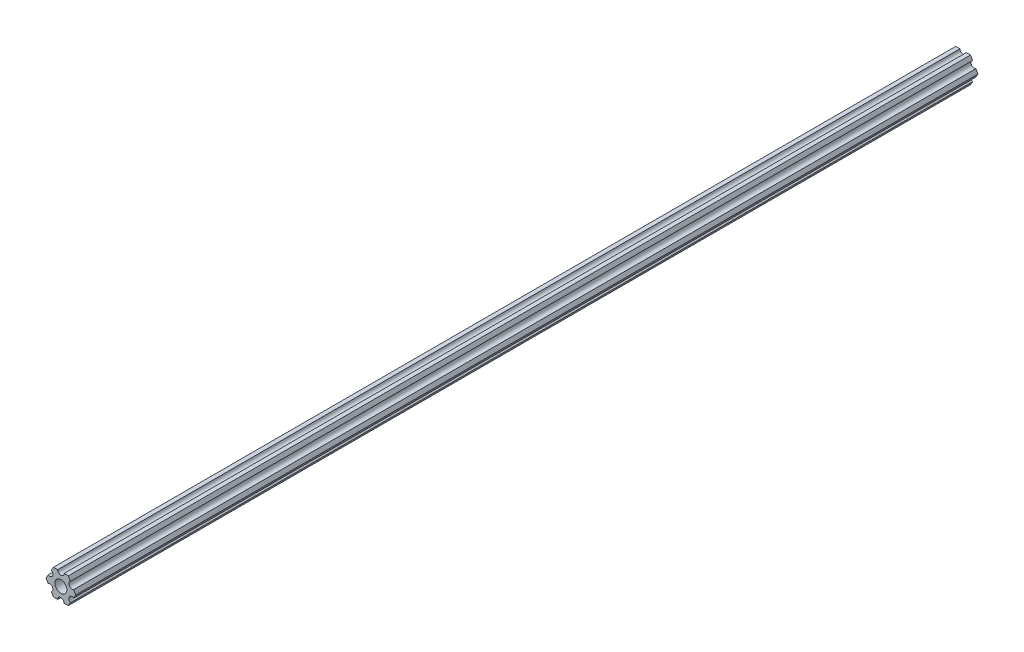
ISO-10303-21;
HEADER;
FILE_DESCRIPTION(('STEP AP214'),'2;1');
FILE_NAME('part.step','',(''),(''),'','','');
FILE_SCHEMA(('AUTOMOTIVE_DESIGN { 1 0 10303 214 1 1 1 1 }'));
ENDSEC;
DATA;
#1=APPLICATION_CONTEXT('core data for automotive mechanical design processes');
#2=APPLICATION_PROTOCOL_DEFINITION('international standard','automotive_design',2000,#1);
#3=PRODUCT_CONTEXT('',#1,'mechanical');
#4=PRODUCT('Part','Part','',(#3));
#5=PRODUCT_RELATED_PRODUCT_CATEGORY('part','',(#4));
#6=PRODUCT_DEFINITION_FORMATION('','',#4);
#7=PRODUCT_DEFINITION_CONTEXT('part definition',#1,'design');
#8=PRODUCT_DEFINITION('design','',#6,#7);
#9=PRODUCT_DEFINITION_SHAPE('','',#8);
#10=(LENGTH_UNIT() NAMED_UNIT(*) SI_UNIT(.MILLI.,.METRE.));
#11=(NAMED_UNIT(*) PLANE_ANGLE_UNIT() SI_UNIT($,.RADIAN.));
#12=(NAMED_UNIT(*) SI_UNIT($,.STERADIAN.) SOLID_ANGLE_UNIT());
#13=UNCERTAINTY_MEASURE_WITH_UNIT(LENGTH_MEASURE(1.E-05),#10,'distance_accuracy_value','');
#14=(GEOMETRIC_REPRESENTATION_CONTEXT(3) GLOBAL_UNCERTAINTY_ASSIGNED_CONTEXT((#13)) GLOBAL_UNIT_ASSIGNED_CONTEXT((#10,
#11,#12)) REPRESENTATION_CONTEXT('',''));
#15=CARTESIAN_POINT('',(0.,0.,0.));
#16=DIRECTION('',(0.,0.,1.));
#17=DIRECTION('',(1.,0.,0.));
#18=AXIS2_PLACEMENT_3D('',#15,#16,#17);
#19=CARTESIAN_POINT('',(6.29301142309098,-1.80018429024546,85.725));
#20=DIRECTION('',(-0.866025434075723,0.499999947533953,0.));
#21=DIRECTION('',(0.,0.,1.));
#22=AXIS2_PLACEMENT_3D('',#19,#20,#21);
#23=PLANE('',#22);
#24=DIRECTION('',(0.,0.,1.));
#25=VECTOR('',#24,1.);
#26=CARTESIAN_POINT('',(7.33234841870827,4.44212519169686E-07,85.725));
#27=LINE('',#26,#25);
#28=CARTESIAN_POINT('',(7.33234841870826,4.44212518961143E-07,-358.775));
#29=VERTEX_POINT('',#28);
#30=CARTESIAN_POINT('',(7.33234841870826,4.44212519315656E-07,85.725));
#31=VERTEX_POINT('',#30);
#32=EDGE_CURVE('E11',#29,#31,#27,.T.);
#33=ORIENTED_EDGE('',*,*,#32,.T.);
#34=DIRECTION('',(0.499999947533953,0.866025434075723,0.));
#35=VECTOR('',#34,1.);
#36=CARTESIAN_POINT('',(6.29301142309098,-1.80018429024546,85.725));
#37=LINE('',#36,#35);
#38=CARTESIAN_POINT('',(6.29301142309098,-1.80018429024546,85.725));
#39=VERTEX_POINT('',#38);
#40=EDGE_CURVE('E301',#39,#31,#37,.T.);
#41=ORIENTED_EDGE('',*,*,#40,.F.);
#42=DIRECTION('',(0.,0.,-1.));
#43=VECTOR('',#42,1.);
#44=CARTESIAN_POINT('',(6.29301142309098,-1.80018429024546,85.725));
#45=LINE('',#44,#43);
#46=CARTESIAN_POINT('',(6.29301142309098,-1.80018429024546,-358.775));
#47=VERTEX_POINT('',#46);
#48=EDGE_CURVE('E300',#39,#47,#45,.T.);
#49=ORIENTED_EDGE('',*,*,#48,.T.);
#50=DIRECTION('',(-0.499999947533953,-0.866025434075723,0.));
#51=VECTOR('',#50,1.);
#52=CARTESIAN_POINT('',(6.29301142309098,-1.80018429024546,-358.775));
#53=LINE('',#52,#51);
#54=EDGE_CURVE('E219',#29,#47,#53,.T.);
#55=ORIENTED_EDGE('',*,*,#54,.F.);
#56=EDGE_LOOP('',(#33,#41,#49,#55));
#57=FACE_BOUND('',#56,.T.);
#58=ADVANCED_FACE('F51',(#57),#23,.F.);
#59=CARTESIAN_POINT('',(7.33234841870827,4.44212519169686E-07,85.725));
#60=DIRECTION('',(-0.866025373493145,-0.500000052466057,0.));
#61=DIRECTION('',(-0.500000052466057,0.866025373493145,0.));
#62=AXIS2_PLACEMENT_3D('',#59,#60,#61);
#63=PLANE('',#62);
#64=DIRECTION('',(0.,0.,1.));
#65=VECTOR('',#64,1.);
#66=CARTESIAN_POINT('',(6.29301120497139,1.80018505273894,85.725));
#67=LINE('',#66,#65);
#68=CARTESIAN_POINT('',(6.29301120497139,1.80018505273894,-358.775));
#69=VERTEX_POINT('',#68);
#70=CARTESIAN_POINT('',(6.29301120497139,1.80018505273894,85.725));
#71=VERTEX_POINT('',#70);
#72=EDGE_CURVE('E59',#69,#71,#67,.T.);
#73=ORIENTED_EDGE('',*,*,#72,.T.);
#74=DIRECTION('',(-0.500000052466057,0.866025373493145,0.));
#75=VECTOR('',#74,1.);
#76=CARTESIAN_POINT('',(7.33234841870827,4.44212519198906E-07,85.725));
#77=LINE('',#76,#75);
#78=EDGE_CURVE('E305',#31,#71,#77,.T.);
#79=ORIENTED_EDGE('',*,*,#78,.F.);
#80=ORIENTED_EDGE('',*,*,#32,.F.);
#81=DIRECTION('',(0.500000052466055,-0.866025373493145,0.));
#82=VECTOR('',#81,1.);
#83=CARTESIAN_POINT('',(7.33234841870826,4.44212518961143E-07,-358.775));
#84=LINE('',#83,#82);
#85=EDGE_CURVE('E213',#69,#29,#84,.T.);
#86=ORIENTED_EDGE('',*,*,#85,.F.);
#87=EDGE_LOOP('',(#73,#79,#80,#86));
#88=FACE_BOUND('',#87,.T.);
#89=ADVANCED_FACE('F214',(#88),#63,.F.);
#90=CARTESIAN_POINT('',(4.70551103839172,4.54981561357972,85.725));
#91=DIRECTION('',(-0.866025373493151,-0.500000052466046,0.));
#92=DIRECTION('',(-0.500000052466046,0.866025373493151,0.));
#93=AXIS2_PLACEMENT_3D('',#90,#91,#92);
#94=PLANE('',#93);
#95=DIRECTION('',(0.,0.,1.));
#96=VECTOR('',#95,1.);
#97=CARTESIAN_POINT('',(3.66617382465481,6.35000022210627,85.725));
#98=LINE('',#97,#96);
#99=CARTESIAN_POINT('',(3.66617382465481,6.35000022210627,-358.775));
#100=VERTEX_POINT('',#99);
#101=CARTESIAN_POINT('',(3.66617382465481,6.35000022210627,85.725));
#102=VERTEX_POINT('',#101);
#103=EDGE_CURVE('E211',#100,#102,#98,.T.);
#104=ORIENTED_EDGE('',*,*,#103,.T.);
#105=DIRECTION('',(-0.500000052466046,0.866025373493151,0.));
#106=VECTOR('',#105,1.);
#107=CARTESIAN_POINT('',(4.70551103839172,4.54981561357972,85.725));
#108=LINE('',#107,#106);
#109=CARTESIAN_POINT('',(4.70551103839172,4.54981561357972,85.725));
#110=VERTEX_POINT('',#109);
#111=EDGE_CURVE('E336',#110,#102,#108,.T.);
#112=ORIENTED_EDGE('',*,*,#111,.F.);
#113=DIRECTION('',(0.,0.,1.));
#114=VECTOR('',#113,1.);
#115=CARTESIAN_POINT('',(4.70551103839172,4.54981561357972,85.725));
#116=LINE('',#115,#114);
#117=CARTESIAN_POINT('',(4.70551103839172,4.54981561357972,-358.775));
#118=VERTEX_POINT('',#117);
#119=EDGE_CURVE('E299',#118,#110,#116,.T.);
#120=ORIENTED_EDGE('',*,*,#119,.F.);
#121=DIRECTION('',(0.500000052466045,-0.866025373493151,0.));
#122=VECTOR('',#121,1.);
#123=CARTESIAN_POINT('',(4.70551103839172,4.54981561357972,-358.775));
#124=LINE('',#123,#122);
#125=EDGE_CURVE('E225',#100,#118,#124,.T.);
#126=ORIENTED_EDGE('',*,*,#125,.F.);
#127=EDGE_LOOP('',(#104,#112,#120,#126));
#128=FACE_BOUND('',#127,.T.);
#129=ADVANCED_FACE('F412',(#128),#94,.F.);
#130=CARTESIAN_POINT('',(3.66617382465481,6.35000022210627,85.725));
#131=DIRECTION('',(6.05825850611185E-08,-1.,0.));
#132=DIRECTION('',(0.,0.,-1.));
#133=AXIS2_PLACEMENT_3D('',#130,#131,#132);
#134=PLANE('',#133);
#135=DIRECTION('',(0.,0.,1.));
#136=VECTOR('',#135,1.);
#137=CARTESIAN_POINT('',(1.58749961530074,6.35000009617482,85.725));
#138=LINE('',#137,#136);
#139=CARTESIAN_POINT('',(1.58749961530073,6.35000015914054,-358.775));
#140=VERTEX_POINT('',#139);
#141=CARTESIAN_POINT('',(1.58749961530073,6.35000015914054,85.725));
#142=VERTEX_POINT('',#141);
#143=EDGE_CURVE('E333',#140,#142,#138,.T.);
#144=ORIENTED_EDGE('',*,*,#143,.T.);
#145=DIRECTION('',(-1.,0.,0.));
#146=VECTOR('',#145,1.);
#147=CARTESIAN_POINT('',(5.49926112168156,6.35000022210627,85.725));
#148=LINE('',#147,#146);
#149=EDGE_CURVE('E340',#102,#142,#148,.T.);
#150=ORIENTED_EDGE('',*,*,#149,.F.);
#151=ORIENTED_EDGE('',*,*,#103,.F.);
#152=DIRECTION('',(1.,3.02912931564594E-08,0.));
#153=VECTOR('',#152,1.);
#154=CARTESIAN_POINT('',(3.66617382465481,6.35000022210627,-358.775));
#155=LINE('',#154,#153);
#156=EDGE_CURVE('E287',#140,#100,#155,.T.);
#157=ORIENTED_EDGE('',*,*,#156,.F.);
#158=EDGE_LOOP('',(#144,#150,#151,#157));
#159=FACE_BOUND('',#158,.T.);
#160=ADVANCED_FACE('F415',(#159),#134,.F.);
#161=CARTESIAN_POINT('',(-3.84699260060323E-07,6.35,85.725));
#162=DIRECTION('',(0.,0.,-1.));
#163=DIRECTION('',(-1.,0.,0.));
#164=AXIS2_PLACEMENT_3D('',#161,#162,#163);
#165=CYLINDRICAL_SURFACE('',#164,1.5875);
#166=DIRECTION('',(0.,0.,1.));
#167=VECTOR('',#166,1.);
#168=CARTESIAN_POINT('',(-1.58750038469926,6.34999990382518,85.725));
#169=LINE('',#168,#167);
#170=CARTESIAN_POINT('',(-1.58750038469926,6.34999990382519,-358.775));
#171=VERTEX_POINT('',#170);
#172=CARTESIAN_POINT('',(-1.58750038469926,6.34999990382519,85.725));
#173=VERTEX_POINT('',#172);
#174=EDGE_CURVE('E330',#171,#173,#169,.T.);
#175=ORIENTED_EDGE('',*,*,#174,.T.);
#176=CARTESIAN_POINT('',(-3.84699260060323E-07,6.35,85.725));
#177=DIRECTION('',(0.,0.,-1.));
#178=DIRECTION('',(-1.,0.,0.));
#179=AXIS2_PLACEMENT_3D('',#176,#177,#178);
#180=CIRCLE('',#179,1.5875);
#181=EDGE_CURVE('E344',#142,#173,#180,.T.);
#182=ORIENTED_EDGE('',*,*,#181,.F.);
#183=ORIENTED_EDGE('',*,*,#143,.F.);
#184=CARTESIAN_POINT('',(-3.84699260060323E-07,6.35,-358.775));
#185=DIRECTION('',(0.,0.,1.));
#186=DIRECTION('',(-1.,0.,0.));
#187=AXIS2_PLACEMENT_3D('',#184,#185,#186);
#188=CIRCLE('',#187,1.5875);
#189=EDGE_CURVE('E283',#171,#140,#188,.T.);
#190=ORIENTED_EDGE('',*,*,#189,.F.);
#191=EDGE_LOOP('',(#175,#182,#183,#190));
#192=FACE_BOUND('',#191,.T.);
#193=ADVANCED_FACE('F464',(#192),#165,.F.);
#194=CARTESIAN_POINT('',(-1.58750038469926,6.34999990382518,85.725));
#195=DIRECTION('',(6.05825963273174E-08,-1.,0.));
#196=DIRECTION('',(0.,0.,-1.));
#197=AXIS2_PLACEMENT_3D('',#194,#195,#196);
#198=PLANE('',#197);
#199=DIRECTION('',(0.,0.,1.));
#200=VECTOR('',#199,1.);
#201=CARTESIAN_POINT('',(-3.66617459405349,6.3499997778937,85.725));
#202=LINE('',#201,#200);
#203=CARTESIAN_POINT('',(-3.66617454558244,6.34999986184803,-358.775));
#204=VERTEX_POINT('',#203);
#205=CARTESIAN_POINT('',(-3.66617454558244,6.34999986184803,85.725));
#206=VERTEX_POINT('',#205);
#207=EDGE_CURVE('E323',#204,#206,#202,.T.);
#208=ORIENTED_EDGE('',*,*,#207,.T.);
#209=DIRECTION('',(-1.,0.,0.));
#210=VECTOR('',#209,1.);
#211=CARTESIAN_POINT('',(5.49926112168156,6.34999990382519,85.725));
#212=LINE('',#211,#210);
#213=EDGE_CURVE('E348',#173,#206,#212,.T.);
#214=ORIENTED_EDGE('',*,*,#213,.F.);
#215=ORIENTED_EDGE('',*,*,#174,.F.);
#216=DIRECTION('',(1.,2.0194198968488E-08,0.));
#217=VECTOR('',#216,1.);
#218=CARTESIAN_POINT('',(-1.58750038469926,6.34999990382519,-358.775));
#219=LINE('',#218,#217);
#220=EDGE_CURVE('E279',#204,#171,#219,.T.);
#221=ORIENTED_EDGE('',*,*,#220,.F.);
#222=EDGE_LOOP('',(#208,#214,#215,#221));
#223=FACE_BOUND('',#222,.T.);
#224=ADVANCED_FACE('F461',(#223),#198,.F.);
#225=CARTESIAN_POINT('',(-3.66617459405349,6.3499997778937,85.725));
#226=DIRECTION('',(0.866025434075729,-0.499999947533942,0.));
#227=DIRECTION('',(0.,0.,-1.));
#228=AXIS2_PLACEMENT_3D('',#225,#226,#227);
#229=PLANE('',#228);
#230=DIRECTION('',(0.,0.,1.));
#231=VECTOR('',#230,1.);
#232=CARTESIAN_POINT('',(-4.70551158967065,4.54981504343587,85.725));
#233=LINE('',#232,#231);
#234=CARTESIAN_POINT('',(-4.70551158967065,4.54981504343587,-358.775));
#235=VERTEX_POINT('',#234);
#236=CARTESIAN_POINT('',(-4.70551158967065,4.54981504343587,85.725));
#237=VERTEX_POINT('',#236);
#238=EDGE_CURVE('E320',#235,#237,#233,.T.);
#239=ORIENTED_EDGE('',*,*,#238,.T.);
#240=DIRECTION('',(-0.499999947533943,-0.866025434075729,0.));
#241=VECTOR('',#240,1.);
#242=CARTESIAN_POINT('',(-3.66617459405349,6.3499997778937,85.725));
#243=LINE('',#242,#241);
#244=EDGE_CURVE('E352',#206,#237,#243,.T.);
#245=ORIENTED_EDGE('',*,*,#244,.F.);
#246=ORIENTED_EDGE('',*,*,#207,.F.);
#247=DIRECTION('',(0.499999947533939,0.866025434075731,0.));
#248=VECTOR('',#247,1.);
#249=CARTESIAN_POINT('',(-3.66617454558244,6.34999986184803,-358.775));
#250=LINE('',#249,#248);
#251=EDGE_CURVE('E275',#235,#204,#250,.T.);
#252=ORIENTED_EDGE('',*,*,#251,.F.);
#253=EDGE_LOOP('',(#239,#245,#246,#252));
#254=FACE_BOUND('',#253,.T.);
#255=ADVANCED_FACE('F457',(#254),#229,.F.);
#256=CARTESIAN_POINT('',(-5.49926150638082,3.17499966684067,85.725));
#257=DIRECTION('',(0.,0.,-1.));
#258=DIRECTION('',(-1.,0.,0.));
#259=AXIS2_PLACEMENT_3D('',#256,#257,#258);
#260=CYLINDRICAL_SURFACE('',#259,1.5875);
#261=DIRECTION('',(0.,0.,1.));
#262=VECTOR('',#261,1.);
#263=CARTESIAN_POINT('',(-6.29301142309098,1.80018429024547,85.725));
#264=LINE('',#263,#262);
#265=CARTESIAN_POINT('',(-6.29301142309098,1.80018429024546,-358.775));
#266=VERTEX_POINT('',#265);
#267=CARTESIAN_POINT('',(-6.29301142309098,1.80018429024547,85.725));
#268=VERTEX_POINT('',#267);
#269=EDGE_CURVE('E324',#266,#268,#264,.T.);
#270=ORIENTED_EDGE('',*,*,#269,.T.);
#271=CARTESIAN_POINT('',(-5.49926150638082,3.17499966684067,85.725));
#272=DIRECTION('',(0.,0.,-1.));
#273=DIRECTION('',(-1.,0.,0.));
#274=AXIS2_PLACEMENT_3D('',#271,#272,#273);
#275=CIRCLE('',#274,1.5875);
#276=EDGE_CURVE('E362',#237,#268,#275,.T.);
#277=ORIENTED_EDGE('',*,*,#276,.F.);
#278=ORIENTED_EDGE('',*,*,#238,.F.);
#279=CARTESIAN_POINT('',(-5.49926150638082,3.17499966684067,-358.775));
#280=DIRECTION('',(0.,0.,1.));
#281=DIRECTION('',(-1.,0.,0.));
#282=AXIS2_PLACEMENT_3D('',#279,#280,#281);
#283=CIRCLE('',#282,1.5875);
#284=EDGE_CURVE('E271',#266,#235,#283,.T.);
#285=ORIENTED_EDGE('',*,*,#284,.F.);
#286=EDGE_LOOP('',(#270,#277,#278,#285));
#287=FACE_BOUND('',#286,.T.);
#288=ADVANCED_FACE('F453',(#287),#260,.F.);
#289=CARTESIAN_POINT('',(-6.29301142309098,1.80018429024547,85.725));
#290=DIRECTION('',(0.866025434075724,-0.499999947533952,0.));
#291=DIRECTION('',(0.,0.,-1.));
#292=AXIS2_PLACEMENT_3D('',#289,#290,#291);
#293=PLANE('',#292);
#294=DIRECTION('',(0.,0.,1.));
#295=VECTOR('',#294,1.);
#296=CARTESIAN_POINT('',(-7.33234841870827,-4.44212523790841E-07,85.725));
#297=LINE('',#296,#295);
#298=CARTESIAN_POINT('',(-7.33234841870826,-4.44212524036367E-07,-358.775));
#299=VERTEX_POINT('',#298);
#300=CARTESIAN_POINT('',(-7.33234841870826,-4.44212524036367E-07,85.725));
#301=VERTEX_POINT('',#300);
#302=EDGE_CURVE('E317',#299,#301,#297,.T.);
#303=ORIENTED_EDGE('',*,*,#302,.T.);
#304=DIRECTION('',(-0.499999947533952,-0.866025434075724,0.));
#305=VECTOR('',#304,1.);
#306=CARTESIAN_POINT('',(-6.29301142309098,1.80018429024547,85.725));
#307=LINE('',#306,#305);
#308=EDGE_CURVE('E358',#268,#301,#307,.T.);
#309=ORIENTED_EDGE('',*,*,#308,.F.);
#310=ORIENTED_EDGE('',*,*,#269,.F.);
#311=DIRECTION('',(0.499999947533951,0.866025434075724,0.));
#312=VECTOR('',#311,1.);
#313=CARTESIAN_POINT('',(-6.29301142309098,1.80018429024547,-358.775));
#314=LINE('',#313,#312);
#315=EDGE_CURVE('E267',#299,#266,#314,.T.);
#316=ORIENTED_EDGE('',*,*,#315,.F.);
#317=EDGE_LOOP('',(#303,#309,#310,#316));
#318=FACE_BOUND('',#317,.T.);
#319=ADVANCED_FACE('F449',(#318),#293,.F.);
#320=CARTESIAN_POINT('',(-7.33234841870827,-4.44212523790841E-07,85.725));
#321=DIRECTION('',(0.866025373493151,0.500000052466045,0.));
#322=DIRECTION('',(0.,0.,-1.));
#323=AXIS2_PLACEMENT_3D('',#320,#321,#322);
#324=PLANE('',#323);
#325=DIRECTION('',(0.,0.,1.));
#326=VECTOR('',#325,1.);
#327=CARTESIAN_POINT('',(-6.29301120497141,-1.80018505273897,85.725));
#328=LINE('',#327,#326);
#329=CARTESIAN_POINT('',(-6.29301120497141,-1.80018505273897,-358.775));
#330=VERTEX_POINT('',#329);
#331=CARTESIAN_POINT('',(-6.29301120497141,-1.80018505273897,85.725));
#332=VERTEX_POINT('',#331);
#333=EDGE_CURVE('E310',#330,#332,#328,.T.);
#334=ORIENTED_EDGE('',*,*,#333,.T.);
#335=DIRECTION('',(0.500000052466045,-0.866025373493151,0.));
#336=VECTOR('',#335,1.);
#337=CARTESIAN_POINT('',(-7.33234841870827,-4.44212523969395E-07,85.725));
#338=LINE('',#337,#336);
#339=EDGE_CURVE('E353',#301,#332,#338,.T.);
#340=ORIENTED_EDGE('',*,*,#339,.F.);
#341=ORIENTED_EDGE('',*,*,#302,.F.);
#342=DIRECTION('',(-0.500000052466045,0.866025373493152,0.));
#343=VECTOR('',#342,1.);
#344=CARTESIAN_POINT('',(-7.33234841870826,-4.44212524036367E-07,-358.775));
#345=LINE('',#344,#343);
#346=EDGE_CURVE('E263',#330,#299,#345,.T.);
#347=ORIENTED_EDGE('',*,*,#346,.F.);
#348=EDGE_LOOP('',(#334,#340,#341,#347));
#349=FACE_BOUND('',#348,.T.);
#350=ADVANCED_FACE('F445',(#349),#324,.F.);
#351=CARTESIAN_POINT('',(-5.49926112168156,-3.17500033315934,85.725));
#352=DIRECTION('',(0.,0.,-1.));
#353=DIRECTION('',(-1.,0.,0.));
#354=AXIS2_PLACEMENT_3D('',#351,#352,#353);
#355=CYLINDRICAL_SURFACE('',#354,1.5875);
#356=DIRECTION('',(0.,0.,1.));
#357=VECTOR('',#356,1.);
#358=CARTESIAN_POINT('',(-4.70551103839172,-4.54981561357972,85.725));
#359=LINE('',#358,#357);
#360=CARTESIAN_POINT('',(-4.70551103839172,-4.54981561357972,-358.775));
#361=VERTEX_POINT('',#360);
#362=CARTESIAN_POINT('',(-4.70551103839172,-4.54981561357972,85.725));
#363=VERTEX_POINT('',#362);
#364=EDGE_CURVE('E307',#361,#363,#359,.T.);
#365=ORIENTED_EDGE('',*,*,#364,.T.);
#366=CARTESIAN_POINT('',(-5.49926112168156,-3.17500033315934,85.725));
#367=DIRECTION('',(0.,0.,-1.));
#368=DIRECTION('',(-1.,0.,0.));
#369=AXIS2_PLACEMENT_3D('',#366,#367,#368);
#370=CIRCLE('',#369,1.5875);
#371=EDGE_CURVE('E357',#332,#363,#370,.T.);
#372=ORIENTED_EDGE('',*,*,#371,.F.);
#373=ORIENTED_EDGE('',*,*,#333,.F.);
#374=CARTESIAN_POINT('',(-5.49926112168156,-3.17500033315934,-358.775));
#375=DIRECTION('',(0.,0.,1.));
#376=DIRECTION('',(-1.,0.,0.));
#377=AXIS2_PLACEMENT_3D('',#374,#375,#376);
#378=CIRCLE('',#377,1.5875);
#379=EDGE_CURVE('E259',#361,#330,#378,.T.);
#380=ORIENTED_EDGE('',*,*,#379,.F.);
#381=EDGE_LOOP('',(#365,#372,#373,#380));
#382=FACE_BOUND('',#381,.T.);
#383=ADVANCED_FACE('F441',(#382),#355,.F.);
#384=CARTESIAN_POINT('',(-4.70551103839172,-4.54981561357972,85.725));
#385=DIRECTION('',(0.866025373493152,0.500000052466045,0.));
#386=DIRECTION('',(0.,0.,-1.));
#387=AXIS2_PLACEMENT_3D('',#384,#385,#386);
#388=PLANE('',#387);
#389=DIRECTION('',(0.,0.,1.));
#390=VECTOR('',#389,1.);
#391=CARTESIAN_POINT('',(-3.66617382465481,-6.35000022210628,85.725));
#392=LINE('',#391,#390);
#393=CARTESIAN_POINT('',(-3.66617382465481,-6.35000022210628,-358.775));
#394=VERTEX_POINT('',#393);
#395=CARTESIAN_POINT('',(-3.66617382465481,-6.35000022210628,85.725));
#396=VERTEX_POINT('',#395);
#397=EDGE_CURVE('E311',#394,#396,#392,.T.);
#398=ORIENTED_EDGE('',*,*,#397,.T.);
#399=DIRECTION('',(0.500000052466045,-0.866025373493151,0.));
#400=VECTOR('',#399,1.);
#401=CARTESIAN_POINT('',(-4.70551103839172,-4.54981561357972,85.725));
#402=LINE('',#401,#400);
#403=EDGE_CURVE('E372',#363,#396,#402,.T.);
#404=ORIENTED_EDGE('',*,*,#403,.F.);
#405=ORIENTED_EDGE('',*,*,#364,.F.);
#406=DIRECTION('',(-0.500000052466043,0.866025373493152,0.));
#407=VECTOR('',#406,1.);
#408=CARTESIAN_POINT('',(-4.70551103839172,-4.54981561357972,-358.775));
#409=LINE('',#408,#407);
#410=EDGE_CURVE('E255',#394,#361,#409,.T.);
#411=ORIENTED_EDGE('',*,*,#410,.F.);
#412=EDGE_LOOP('',(#398,#404,#405,#411));
#413=FACE_BOUND('',#412,.T.);
#414=ADVANCED_FACE('F437',(#413),#388,.F.);
#415=CARTESIAN_POINT('',(-3.66617382465481,-6.35000022210628,85.725));
#416=DIRECTION('',(-6.05825854783851E-08,1.,0.));
#417=DIRECTION('',(0.,0.,1.));
#418=AXIS2_PLACEMENT_3D('',#415,#416,#417);
#419=PLANE('',#418);
#420=DIRECTION('',(0.,0.,1.));
#421=VECTOR('',#420,1.);
#422=CARTESIAN_POINT('',(-1.58749961530074,-6.35,85.725));
#423=LINE('',#422,#421);
#424=CARTESIAN_POINT('',(-1.58749961530073,-6.35000011105314,-358.775));
#425=VERTEX_POINT('',#424);
#426=CARTESIAN_POINT('',(-1.58749961530073,-6.35000011105314,85.725));
#427=VERTEX_POINT('',#426);
#428=EDGE_CURVE('E82',#425,#427,#423,.T.);
#429=ORIENTED_EDGE('',*,*,#428,.T.);
#430=DIRECTION('',(1.,0.,0.));
#431=VECTOR('',#430,1.);
#432=CARTESIAN_POINT('',(5.49926112168156,-6.35000022210628,85.725));
#433=LINE('',#432,#431);
#434=EDGE_CURVE('E376',#396,#427,#433,.T.);
#435=ORIENTED_EDGE('',*,*,#434,.F.);
#436=ORIENTED_EDGE('',*,*,#397,.F.);
#437=DIRECTION('',(-0.999999999999999,-5.34249856349036E-08,0.));
#438=VECTOR('',#437,1.);
#439=CARTESIAN_POINT('',(-3.66617382465481,-6.35000022210628,-358.775));
#440=LINE('',#439,#438);
#441=EDGE_CURVE('E251',#425,#394,#440,.T.);
#442=ORIENTED_EDGE('',*,*,#441,.F.);
#443=EDGE_LOOP('',(#429,#435,#436,#442));
#444=FACE_BOUND('',#443,.T.);
#445=ADVANCED_FACE('F434',(#444),#419,.F.);
#446=CARTESIAN_POINT('',(3.8469926204343E-07,-6.35,85.725));
#447=DIRECTION('',(0.,0.,-1.));
#448=DIRECTION('',(-1.,0.,0.));
#449=AXIS2_PLACEMENT_3D('',#446,#447,#448);
#450=CYLINDRICAL_SURFACE('',#449,1.5875);
#451=DIRECTION('',(0.,0.,1.));
#452=VECTOR('',#451,1.);
#453=CARTESIAN_POINT('',(1.58750038469926,-6.34999990382518,85.725));
#454=LINE('',#453,#452);
#455=CARTESIAN_POINT('',(1.58750038469926,-6.34999990382519,-358.775));
#456=VERTEX_POINT('',#455);
#457=CARTESIAN_POINT('',(1.58750038469926,-6.34999990382519,85.725));
#458=VERTEX_POINT('',#457);
#459=EDGE_CURVE('E71',#456,#458,#454,.T.);
#460=ORIENTED_EDGE('',*,*,#459,.T.);
#461=CARTESIAN_POINT('',(3.8469926204343E-07,-6.35,85.725));
#462=DIRECTION('',(0.,0.,-1.));
#463=DIRECTION('',(-1.,0.,0.));
#464=AXIS2_PLACEMENT_3D('',#461,#462,#463);
#465=CIRCLE('',#464,1.5875);
#466=EDGE_CURVE('E380',#427,#458,#465,.T.);
#467=ORIENTED_EDGE('',*,*,#466,.F.);
#468=ORIENTED_EDGE('',*,*,#428,.F.);
#469=CARTESIAN_POINT('',(3.8469926204343E-07,-6.35,-358.775));
#470=DIRECTION('',(0.,0.,1.));
#471=DIRECTION('',(-1.,0.,0.));
#472=AXIS2_PLACEMENT_3D('',#469,#470,#471);
#473=CIRCLE('',#472,1.5875);
#474=EDGE_CURVE('E247',#456,#425,#473,.T.);
#475=ORIENTED_EDGE('',*,*,#474,.F.);
#476=EDGE_LOOP('',(#460,#467,#468,#475));
#477=FACE_BOUND('',#476,.T.);
#478=ADVANCED_FACE('F432',(#477),#450,.F.);
#479=CARTESIAN_POINT('',(1.58750038469926,-6.34999990382518,85.725));
#480=DIRECTION('',(-6.05825721258438E-08,1.,0.));
#481=DIRECTION('',(0.,0.,1.));
#482=AXIS2_PLACEMENT_3D('',#479,#480,#481);
#483=PLANE('',#482);
#484=DIRECTION('',(0.,0.,1.));
#485=VECTOR('',#484,1.);
#486=CARTESIAN_POINT('',(3.66617459405346,-6.34999977789375,85.725));
#487=LINE('',#486,#485);
#488=CARTESIAN_POINT('',(3.66617454558244,-6.34999986184804,-358.775));
#489=VERTEX_POINT('',#488);
#490=CARTESIAN_POINT('',(3.66617454558244,-6.34999986184804,85.725));
#491=VERTEX_POINT('',#490);
#492=EDGE_CURVE('E381',#489,#491,#487,.T.);
#493=ORIENTED_EDGE('',*,*,#492,.T.);
#494=DIRECTION('',(1.,0.,0.));
#495=VECTOR('',#494,1.);
#496=CARTESIAN_POINT('',(5.49926112168156,-6.34999990382519,85.725));
#497=LINE('',#496,#495);
#498=EDGE_CURVE('E388',#458,#491,#497,.T.);
#499=ORIENTED_EDGE('',*,*,#498,.F.);
#500=ORIENTED_EDGE('',*,*,#459,.F.);
#501=DIRECTION('',(-1.,-2.01941943785532E-08,0.));
#502=VECTOR('',#501,1.);
#503=CARTESIAN_POINT('',(1.58750038469926,-6.34999990382519,-358.775));
#504=LINE('',#503,#502);
#505=EDGE_CURVE('E243',#489,#456,#504,.T.);
#506=ORIENTED_EDGE('',*,*,#505,.F.);
#507=EDGE_LOOP('',(#493,#499,#500,#506));
#508=FACE_BOUND('',#507,.T.);
#509=ADVANCED_FACE('F431',(#508),#483,.F.);
#510=CARTESIAN_POINT('',(3.66617459405346,-6.34999977789375,85.725));
#511=DIRECTION('',(-0.86602543407573,0.499999947533941,0.));
#512=DIRECTION('',(0.,0.,1.));
#513=AXIS2_PLACEMENT_3D('',#510,#511,#512);
#514=PLANE('',#513);
#515=DIRECTION('',(0.,0.,-1.));
#516=VECTOR('',#515,1.);
#517=CARTESIAN_POINT('',(4.70551158967065,-4.54981504343587,85.725));
#518=LINE('',#517,#516);
#519=CARTESIAN_POINT('',(4.70551158967065,-4.54981504343587,85.725));
#520=VERTEX_POINT('',#519);
#521=CARTESIAN_POINT('',(4.70551158967065,-4.54981504343587,-358.775));
#522=VERTEX_POINT('',#521);
#523=EDGE_CURVE('E384',#520,#522,#518,.T.);
#524=ORIENTED_EDGE('',*,*,#523,.F.);
#525=DIRECTION('',(0.49999994753394,0.86602543407573,0.));
#526=VECTOR('',#525,1.);
#527=CARTESIAN_POINT('',(3.66617459405346,-6.34999977789376,85.725));
#528=LINE('',#527,#526);
#529=EDGE_CURVE('E306',#491,#520,#528,.T.);
#530=ORIENTED_EDGE('',*,*,#529,.F.);
#531=ORIENTED_EDGE('',*,*,#492,.F.);
#532=DIRECTION('',(-0.499999947533941,-0.86602543407573,0.));
#533=VECTOR('',#532,1.);
#534=CARTESIAN_POINT('',(3.66617454558244,-6.34999986184804,-358.775));
#535=LINE('',#534,#533);
#536=EDGE_CURVE('E239',#522,#489,#535,.T.);
#537=ORIENTED_EDGE('',*,*,#536,.F.);
#538=EDGE_LOOP('',(#524,#530,#531,#537));
#539=FACE_BOUND('',#538,.T.);
#540=ADVANCED_FACE('F428',(#539),#514,.F.);
#541=CARTESIAN_POINT('',(5.49926112168156,3.17500033315934,85.725));
#542=DIRECTION('',(0.,0.,1.));
#543=DIRECTION('',(1.,0.,0.));
#544=AXIS2_PLACEMENT_3D('',#541,#542,#543);
#545=PLANE('',#544);
#546=CARTESIAN_POINT('',(0.,0.,85.725));
#547=DIRECTION('',(0.,0.,-1.));
#548=DIRECTION('',(-1.,0.,0.));
#549=AXIS2_PLACEMENT_3D('',#546,#547,#548);
#550=CIRCLE('',#549,2.9337);
#551=CARTESIAN_POINT('',(-2.9337,0.,85.725));
#552=VERTEX_POINT('',#551);
#553=EDGE_CURVE('E292',#552,#552,#550,.T.);
#554=ORIENTED_EDGE('',*,*,#553,.T.);
#555=EDGE_LOOP('',(#554));
#556=FACE_BOUND('',#555,.T.);
#557=ORIENTED_EDGE('',*,*,#529,.T.);
#558=CARTESIAN_POINT('',(5.49926150638082,-3.17499966684067,85.725));
#559=DIRECTION('',(0.,0.,-1.));
#560=DIRECTION('',(-1.,0.,0.));
#561=AXIS2_PLACEMENT_3D('',#558,#559,#560);
#562=CIRCLE('',#561,1.5875);
#563=EDGE_CURVE('E296',#520,#39,#562,.T.);
#564=ORIENTED_EDGE('',*,*,#563,.T.);
#565=ORIENTED_EDGE('',*,*,#40,.T.);
#566=ORIENTED_EDGE('',*,*,#78,.T.);
#567=CARTESIAN_POINT('',(5.49926112168156,3.17500033315934,85.725));
#568=DIRECTION('',(0.,0.,-1.));
#569=DIRECTION('',(-1.,0.,0.));
#570=AXIS2_PLACEMENT_3D('',#567,#568,#569);
#571=CIRCLE('',#570,1.5875);
#572=EDGE_CURVE('E206',#71,#110,#571,.T.);
#573=ORIENTED_EDGE('',*,*,#572,.T.);
#574=ORIENTED_EDGE('',*,*,#111,.T.);
#575=ORIENTED_EDGE('',*,*,#149,.T.);
#576=ORIENTED_EDGE('',*,*,#181,.T.);
#577=ORIENTED_EDGE('',*,*,#213,.T.);
#578=ORIENTED_EDGE('',*,*,#244,.T.);
#579=ORIENTED_EDGE('',*,*,#276,.T.);
#580=ORIENTED_EDGE('',*,*,#308,.T.);
#581=ORIENTED_EDGE('',*,*,#339,.T.);
#582=ORIENTED_EDGE('',*,*,#371,.T.);
#583=ORIENTED_EDGE('',*,*,#403,.T.);
#584=ORIENTED_EDGE('',*,*,#434,.T.);
#585=ORIENTED_EDGE('',*,*,#466,.T.);
#586=ORIENTED_EDGE('',*,*,#498,.T.);
#587=EDGE_LOOP('',(#557,#564,#565,#566,#573,#574,#575,#576,#577,#578,#579,#580,#581,#582,#583,
#584,#585,#586));
#588=FACE_BOUND('',#587,.T.);
#589=ADVANCED_FACE('F418',(#556,#588),#545,.T.);
#590=CARTESIAN_POINT('',(5.49926112168156,3.17500033315934,85.725));
#591=DIRECTION('',(0.,0.,-1.));
#592=DIRECTION('',(-1.,0.,0.));
#593=AXIS2_PLACEMENT_3D('',#590,#591,#592);
#594=CYLINDRICAL_SURFACE('',#593,1.5875);
#595=ORIENTED_EDGE('',*,*,#572,.F.);
#596=ORIENTED_EDGE('',*,*,#72,.F.);
#597=CARTESIAN_POINT('',(5.49926112168156,3.17500033315934,-358.775));
#598=DIRECTION('',(0.,0.,1.));
#599=DIRECTION('',(-1.,0.,0.));
#600=AXIS2_PLACEMENT_3D('',#597,#598,#599);
#601=CIRCLE('',#600,1.5875);
#602=EDGE_CURVE('E203',#118,#69,#601,.T.);
#603=ORIENTED_EDGE('',*,*,#602,.F.);
#604=ORIENTED_EDGE('',*,*,#119,.T.);
#605=EDGE_LOOP('',(#595,#596,#603,#604));
#606=FACE_BOUND('',#605,.T.);
#607=ADVANCED_FACE('F200',(#606),#594,.F.);
#608=CARTESIAN_POINT('',(5.49926150638082,-3.17499966684067,85.725));
#609=DIRECTION('',(0.,0.,-1.));
#610=DIRECTION('',(-1.,0.,0.));
#611=AXIS2_PLACEMENT_3D('',#608,#609,#610);
#612=CYLINDRICAL_SURFACE('',#611,1.5875);
#613=ORIENTED_EDGE('',*,*,#563,.F.);
#614=ORIENTED_EDGE('',*,*,#523,.T.);
#615=CARTESIAN_POINT('',(5.49926150638082,-3.17499966684067,-358.775));
#616=DIRECTION('',(0.,0.,1.));
#617=DIRECTION('',(-1.,0.,0.));
#618=AXIS2_PLACEMENT_3D('',#615,#616,#617);
#619=CIRCLE('',#618,1.5875);
#620=EDGE_CURVE('E235',#47,#522,#619,.T.);
#621=ORIENTED_EDGE('',*,*,#620,.F.);
#622=ORIENTED_EDGE('',*,*,#48,.F.);
#623=EDGE_LOOP('',(#613,#614,#621,#622));
#624=FACE_BOUND('',#623,.T.);
#625=ADVANCED_FACE('F423',(#624),#612,.F.);
#626=CARTESIAN_POINT('',(0.,0.,85.725));
#627=DIRECTION('',(0.,0.,-1.));
#628=DIRECTION('',(-1.,0.,0.));
#629=AXIS2_PLACEMENT_3D('',#626,#627,#628);
#630=CYLINDRICAL_SURFACE('',#629,2.9337);
#631=ORIENTED_EDGE('',*,*,#553,.F.);
#632=EDGE_LOOP('',(#631));
#633=FACE_BOUND('',#632,.T.);
#634=CARTESIAN_POINT('',(0.,0.,-358.775));
#635=DIRECTION('',(0.,0.,-1.));
#636=DIRECTION('',(-1.,0.,0.));
#637=AXIS2_PLACEMENT_3D('',#634,#635,#636);
#638=CIRCLE('',#637,2.9337);
#639=CARTESIAN_POINT('',(-2.9337,0.,-358.775));
#640=VERTEX_POINT('',#639);
#641=EDGE_CURVE('E227',#640,#640,#638,.T.);
#642=ORIENTED_EDGE('',*,*,#641,.T.);
#643=EDGE_LOOP('',(#642));
#644=FACE_BOUND('',#643,.T.);
#645=ADVANCED_FACE('F483',(#633,#644),#630,.F.);
#646=CARTESIAN_POINT('',(5.49926112168156,3.17500033315934,-358.775));
#647=DIRECTION('',(0.,0.,-1.));
#648=DIRECTION('',(-1.,0.,0.));
#649=AXIS2_PLACEMENT_3D('',#646,#647,#648);
#650=PLANE('',#649);
#651=ORIENTED_EDGE('',*,*,#602,.T.);
#652=ORIENTED_EDGE('',*,*,#85,.T.);
#653=ORIENTED_EDGE('',*,*,#54,.T.);
#654=ORIENTED_EDGE('',*,*,#620,.T.);
#655=ORIENTED_EDGE('',*,*,#536,.T.);
#656=ORIENTED_EDGE('',*,*,#505,.T.);
#657=ORIENTED_EDGE('',*,*,#474,.T.);
#658=ORIENTED_EDGE('',*,*,#441,.T.);
#659=ORIENTED_EDGE('',*,*,#410,.T.);
#660=ORIENTED_EDGE('',*,*,#379,.T.);
#661=ORIENTED_EDGE('',*,*,#346,.T.);
#662=ORIENTED_EDGE('',*,*,#315,.T.);
#663=ORIENTED_EDGE('',*,*,#284,.T.);
#664=ORIENTED_EDGE('',*,*,#251,.T.);
#665=ORIENTED_EDGE('',*,*,#220,.T.);
#666=ORIENTED_EDGE('',*,*,#189,.T.);
#667=ORIENTED_EDGE('',*,*,#156,.T.);
#668=ORIENTED_EDGE('',*,*,#125,.T.);
#669=EDGE_LOOP('',(#651,#652,#653,#654,#655,#656,#657,#658,#659,#660,#661,#662,#663,#664,#665,
#666,#667,#668));
#670=FACE_BOUND('',#669,.T.);
#671=ORIENTED_EDGE('',*,*,#641,.F.);
#672=EDGE_LOOP('',(#671));
#673=FACE_BOUND('',#672,.T.);
#674=ADVANCED_FACE('F221',(#670,#673),#650,.T.);
#675=CLOSED_SHELL('',(#58,#89,#129,#160,#193,#224,#255,#288,#319,#350,#383,#414,#445,#478,#509,
#540,#589,#607,#625,#645,#674));
#676=MANIFOLD_SOLID_BREP('B2',#675);
#677=ADVANCED_BREP_SHAPE_REPRESENTATION('',(#18,#676),#14);
#678=SHAPE_DEFINITION_REPRESENTATION(#9,#677);
ENDSEC;
END-ISO-10303-21;
